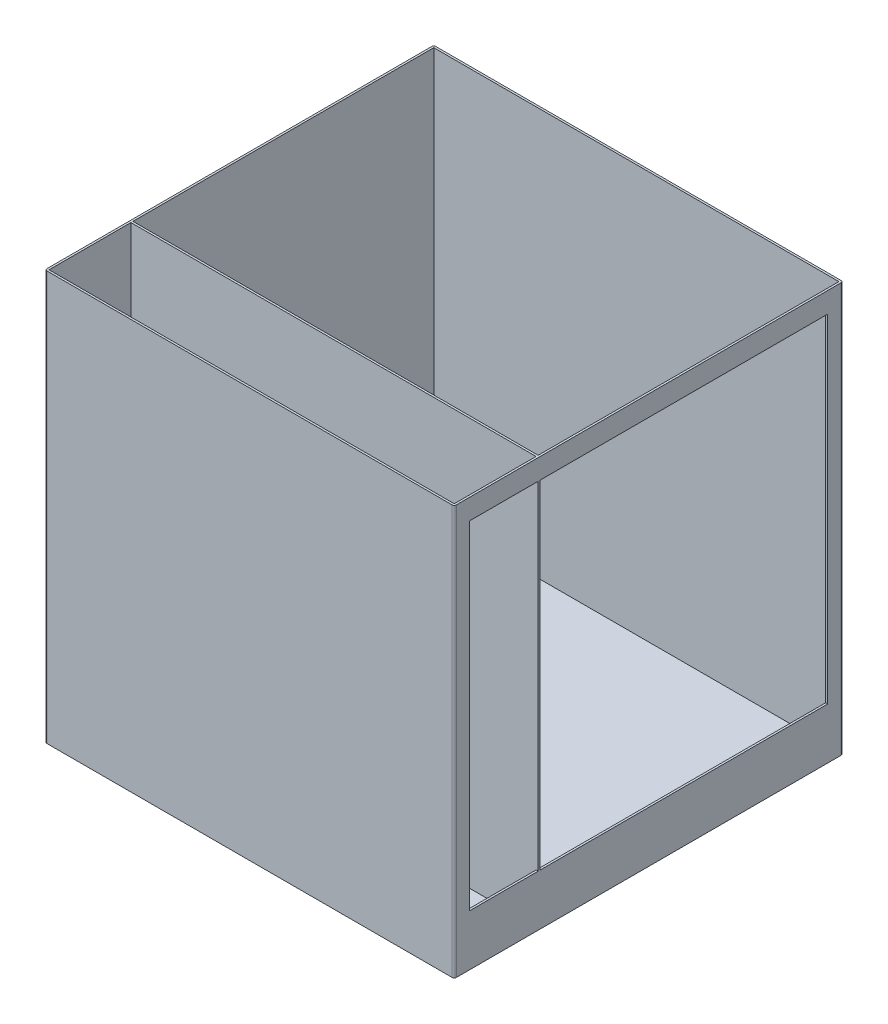
ISO-10303-21;
HEADER;
FILE_DESCRIPTION(('STEP AP214'),'2;1');
FILE_NAME('part.step','',(''),(''),'','','');
FILE_SCHEMA(('AUTOMOTIVE_DESIGN { 1 0 10303 214 1 1 1 1 }'));
ENDSEC;
DATA;
#1=APPLICATION_CONTEXT('core data for automotive mechanical design processes');
#2=APPLICATION_PROTOCOL_DEFINITION('international standard','automotive_design',2000,#1);
#3=PRODUCT_CONTEXT('',#1,'mechanical');
#4=PRODUCT('Part','Part','',(#3));
#5=PRODUCT_RELATED_PRODUCT_CATEGORY('part','',(#4));
#6=PRODUCT_DEFINITION_FORMATION('','',#4);
#7=PRODUCT_DEFINITION_CONTEXT('part definition',#1,'design');
#8=PRODUCT_DEFINITION('design','',#6,#7);
#9=PRODUCT_DEFINITION_SHAPE('','',#8);
#10=(LENGTH_UNIT() NAMED_UNIT(*) SI_UNIT(.MILLI.,.METRE.));
#11=(NAMED_UNIT(*) PLANE_ANGLE_UNIT() SI_UNIT($,.RADIAN.));
#12=(NAMED_UNIT(*) SI_UNIT($,.STERADIAN.) SOLID_ANGLE_UNIT());
#13=UNCERTAINTY_MEASURE_WITH_UNIT(LENGTH_MEASURE(1.E-05),#10,'distance_accuracy_value','');
#14=(GEOMETRIC_REPRESENTATION_CONTEXT(3) GLOBAL_UNCERTAINTY_ASSIGNED_CONTEXT((#13)) GLOBAL_UNIT_ASSIGNED_CONTEXT((#10,
#11,#12)) REPRESENTATION_CONTEXT('',''));
#15=CARTESIAN_POINT('',(0.,0.,0.));
#16=DIRECTION('',(0.,0.,1.));
#17=DIRECTION('',(1.,0.,0.));
#18=AXIS2_PLACEMENT_3D('',#15,#16,#17);
#19=CARTESIAN_POINT('',(198.,200.,190.));
#20=DIRECTION('',(-1.,0.,0.));
#21=DIRECTION('',(0.,0.,1.));
#22=AXIS2_PLACEMENT_3D('',#19,#20,#21);
#23=PLANE('',#22);
#24=DIRECTION('',(0.,-1.,0.));
#25=VECTOR('',#24,1.);
#26=CARTESIAN_POINT('',(198.,200.,106.));
#27=LINE('',#26,#25);
#28=CARTESIAN_POINT('',(198.,200.,106.));
#29=VERTEX_POINT('',#28);
#30=CARTESIAN_POINT('',(198.,180.,106.));
#31=VERTEX_POINT('',#30);
#32=EDGE_CURVE('E211',#29,#31,#27,.T.);
#33=ORIENTED_EDGE('',*,*,#32,.F.);
#34=DIRECTION('',(0.,0.,-1.));
#35=VECTOR('',#34,1.);
#36=CARTESIAN_POINT('',(198.,200.,0.));
#37=LINE('',#36,#35);
#38=CARTESIAN_POINT('',(198.,200.,-188.));
#39=VERTEX_POINT('',#38);
#40=EDGE_CURVE('E357',#29,#39,#37,.T.);
#41=ORIENTED_EDGE('',*,*,#40,.T.);
#42=DIRECTION('',(0.,1.,0.));
#43=VECTOR('',#42,1.);
#44=CARTESIAN_POINT('',(198.,200.,-188.));
#45=LINE('',#44,#43);
#46=CARTESIAN_POINT('',(198.,-198.,-188.));
#47=VERTEX_POINT('',#46);
#48=EDGE_CURVE('E344',#47,#39,#45,.T.);
#49=ORIENTED_EDGE('',*,*,#48,.F.);
#50=DIRECTION('',(0.,0.,-1.));
#51=VECTOR('',#50,1.);
#52=CARTESIAN_POINT('',(198.,-198.,0.));
#53=LINE('',#52,#51);
#54=CARTESIAN_POINT('',(198.,-198.,106.));
#55=VERTEX_POINT('',#54);
#56=EDGE_CURVE('E333',#55,#47,#53,.T.);
#57=ORIENTED_EDGE('',*,*,#56,.F.);
#58=CARTESIAN_POINT('',(198.,-150.,106.));
#59=VERTEX_POINT('',#58);
#60=EDGE_CURVE('E383',#59,#55,#27,.T.);
#61=ORIENTED_EDGE('',*,*,#60,.F.);
#62=DIRECTION('',(0.,0.,1.));
#63=VECTOR('',#62,1.);
#64=CARTESIAN_POINT('',(198.,-150.,-175.));
#65=LINE('',#64,#63);
#66=CARTESIAN_POINT('',(198.,-150.,-175.));
#67=VERTEX_POINT('',#66);
#68=EDGE_CURVE('E327',#67,#59,#65,.T.);
#69=ORIENTED_EDGE('',*,*,#68,.F.);
#70=DIRECTION('',(0.,-1.,0.));
#71=VECTOR('',#70,1.);
#72=CARTESIAN_POINT('',(198.,180.,-175.));
#73=LINE('',#72,#71);
#74=CARTESIAN_POINT('',(198.,180.,-175.));
#75=VERTEX_POINT('',#74);
#76=EDGE_CURVE('E323',#75,#67,#73,.T.);
#77=ORIENTED_EDGE('',*,*,#76,.F.);
#78=DIRECTION('',(0.,0.,-1.));
#79=VECTOR('',#78,1.);
#80=CARTESIAN_POINT('',(198.,180.,-175.));
#81=LINE('',#80,#79);
#82=EDGE_CURVE('E320',#31,#75,#81,.T.);
#83=ORIENTED_EDGE('',*,*,#82,.F.);
#84=EDGE_LOOP('',(#33,#41,#49,#57,#61,#69,#77,#83));
#85=FACE_BOUND('',#84,.T.);
#86=ADVANCED_FACE('F33',(#85),#23,.T.);
#87=CARTESIAN_POINT('',(-198.,200.,190.));
#88=DIRECTION('',(1.,0.,0.));
#89=DIRECTION('',(0.,0.,-1.));
#90=AXIS2_PLACEMENT_3D('',#87,#88,#89);
#91=PLANE('',#90);
#92=DIRECTION('',(0.,1.,0.));
#93=VECTOR('',#92,1.);
#94=CARTESIAN_POINT('',(-198.,200.,106.));
#95=LINE('',#94,#93);
#96=CARTESIAN_POINT('',(-198.,-198.,106.));
#97=VERTEX_POINT('',#96);
#98=CARTESIAN_POINT('',(-198.,200.,106.));
#99=VERTEX_POINT('',#98);
#100=EDGE_CURVE('E321',#97,#99,#95,.T.);
#101=ORIENTED_EDGE('',*,*,#100,.F.);
#102=DIRECTION('',(0.,0.,1.));
#103=VECTOR('',#102,1.);
#104=CARTESIAN_POINT('',(-198.,-198.,0.));
#105=LINE('',#104,#103);
#106=CARTESIAN_POINT('',(-198.,-198.,-188.));
#107=VERTEX_POINT('',#106);
#108=EDGE_CURVE('E352',#107,#97,#105,.T.);
#109=ORIENTED_EDGE('',*,*,#108,.F.);
#110=DIRECTION('',(0.,1.,0.));
#111=VECTOR('',#110,1.);
#112=CARTESIAN_POINT('',(-198.,200.,-188.));
#113=LINE('',#112,#111);
#114=CARTESIAN_POINT('',(-198.,200.,-188.));
#115=VERTEX_POINT('',#114);
#116=EDGE_CURVE('E347',#107,#115,#113,.T.);
#117=ORIENTED_EDGE('',*,*,#116,.T.);
#118=DIRECTION('',(0.,0.,1.));
#119=VECTOR('',#118,1.);
#120=CARTESIAN_POINT('',(-198.,200.,0.));
#121=LINE('',#120,#119);
#122=EDGE_CURVE('E218',#115,#99,#121,.T.);
#123=ORIENTED_EDGE('',*,*,#122,.T.);
#124=EDGE_LOOP('',(#101,#109,#117,#123));
#125=FACE_BOUND('',#124,.T.);
#126=ADVANCED_FACE('F375',(#125),#91,.T.);
#127=CARTESIAN_POINT('',(0.,-198.,0.));
#128=DIRECTION('',(0.,-1.,0.));
#129=DIRECTION('',(0.,0.,-1.));
#130=AXIS2_PLACEMENT_3D('',#127,#128,#129);
#131=PLANE('',#130);
#132=ORIENTED_EDGE('',*,*,#108,.T.);
#133=DIRECTION('',(1.,0.,0.));
#134=VECTOR('',#133,1.);
#135=CARTESIAN_POINT('',(0.,-198.,106.));
#136=LINE('',#135,#134);
#137=EDGE_CURVE('E380',#97,#55,#136,.T.);
#138=ORIENTED_EDGE('',*,*,#137,.T.);
#139=ORIENTED_EDGE('',*,*,#56,.T.);
#140=DIRECTION('',(-1.,0.,0.));
#141=VECTOR('',#140,1.);
#142=CARTESIAN_POINT('',(0.,-198.,-188.));
#143=LINE('',#142,#141);
#144=EDGE_CURVE('E343',#47,#107,#143,.T.);
#145=ORIENTED_EDGE('',*,*,#144,.T.);
#146=EDGE_LOOP('',(#132,#138,#139,#145));
#147=FACE_BOUND('',#146,.T.);
#148=ADVANCED_FACE('F379',(#147),#131,.F.);
#149=CARTESIAN_POINT('',(200.,-150.,-175.));
#150=DIRECTION('',(0.,-1.,0.));
#151=DIRECTION('',(0.,0.,-1.));
#152=AXIS2_PLACEMENT_3D('',#149,#150,#151);
#153=PLANE('',#152);
#154=ORIENTED_EDGE('',*,*,#68,.T.);
#155=DIRECTION('',(1.,0.,0.));
#156=VECTOR('',#155,1.);
#157=CARTESIAN_POINT('',(200.,-150.,106.));
#158=LINE('',#157,#156);
#159=CARTESIAN_POINT('',(200.,-150.,106.));
#160=VERTEX_POINT('',#159);
#161=EDGE_CURVE('E386',#59,#160,#158,.T.);
#162=ORIENTED_EDGE('',*,*,#161,.T.);
#163=DIRECTION('',(0.,0.,1.));
#164=VECTOR('',#163,1.);
#165=CARTESIAN_POINT('',(200.,-150.,-175.));
#166=LINE('',#165,#164);
#167=CARTESIAN_POINT('',(200.,-150.,-175.));
#168=VERTEX_POINT('',#167);
#169=EDGE_CURVE('E314',#168,#160,#166,.T.);
#170=ORIENTED_EDGE('',*,*,#169,.F.);
#171=DIRECTION('',(-1.,0.,0.));
#172=VECTOR('',#171,1.);
#173=CARTESIAN_POINT('',(200.,-150.,-175.));
#174=LINE('',#173,#172);
#175=EDGE_CURVE('E334',#168,#67,#174,.T.);
#176=ORIENTED_EDGE('',*,*,#175,.T.);
#177=EDGE_LOOP('',(#154,#162,#170,#176));
#178=FACE_BOUND('',#177,.T.);
#179=ADVANCED_FACE('F390',(#178),#153,.F.);
#180=CARTESIAN_POINT('',(200.,180.,-175.));
#181=DIRECTION('',(0.,1.,0.));
#182=DIRECTION('',(0.,0.,1.));
#183=AXIS2_PLACEMENT_3D('',#180,#181,#182);
#184=PLANE('',#183);
#185=DIRECTION('',(0.,0.,-1.));
#186=VECTOR('',#185,1.);
#187=CARTESIAN_POINT('',(200.,180.,-175.));
#188=LINE('',#187,#186);
#189=CARTESIAN_POINT('',(200.,180.,106.));
#190=VERTEX_POINT('',#189);
#191=CARTESIAN_POINT('',(200.,180.,-175.));
#192=VERTEX_POINT('',#191);
#193=EDGE_CURVE('E306',#190,#192,#188,.T.);
#194=ORIENTED_EDGE('',*,*,#193,.F.);
#195=DIRECTION('',(-1.,0.,0.));
#196=VECTOR('',#195,1.);
#197=CARTESIAN_POINT('',(200.,180.,106.));
#198=LINE('',#197,#196);
#199=EDGE_CURVE('E11',#190,#31,#198,.T.);
#200=ORIENTED_EDGE('',*,*,#199,.T.);
#201=ORIENTED_EDGE('',*,*,#82,.T.);
#202=DIRECTION('',(-1.,0.,0.));
#203=VECTOR('',#202,1.);
#204=CARTESIAN_POINT('',(200.,180.,-175.));
#205=LINE('',#204,#203);
#206=EDGE_CURVE('E336',#192,#75,#205,.T.);
#207=ORIENTED_EDGE('',*,*,#206,.F.);
#208=EDGE_LOOP('',(#194,#200,#201,#207));
#209=FACE_BOUND('',#208,.T.);
#210=ADVANCED_FACE('F398',(#209),#184,.F.);
#211=CARTESIAN_POINT('',(0.,200.,0.));
#212=DIRECTION('',(0.,-1.,0.));
#213=DIRECTION('',(0.,0.,-1.));
#214=AXIS2_PLACEMENT_3D('',#211,#212,#213);
#215=PLANE('',#214);
#216=DIRECTION('',(-1.,0.,0.));
#217=VECTOR('',#216,1.);
#218=CARTESIAN_POINT('',(-200.,200.,106.));
#219=LINE('',#218,#217);
#220=EDGE_CURVE('E202',#29,#99,#219,.T.);
#221=ORIENTED_EDGE('',*,*,#220,.T.);
#222=ORIENTED_EDGE('',*,*,#122,.F.);
#223=DIRECTION('',(-1.,0.,0.));
#224=VECTOR('',#223,1.);
#225=CARTESIAN_POINT('',(0.,200.,-188.));
#226=LINE('',#225,#224);
#227=EDGE_CURVE('E219',#39,#115,#226,.T.);
#228=ORIENTED_EDGE('',*,*,#227,.F.);
#229=ORIENTED_EDGE('',*,*,#40,.F.);
#230=EDGE_LOOP('',(#221,#222,#228,#229));
#231=FACE_BOUND('',#230,.T.);
#232=DIRECTION('',(1.,0.,0.));
#233=VECTOR('',#232,1.);
#234=CARTESIAN_POINT('',(-200.,200.,108.));
#235=LINE('',#234,#233);
#236=CARTESIAN_POINT('',(-198.,200.,108.));
#237=VERTEX_POINT('',#236);
#238=CARTESIAN_POINT('',(198.,200.,108.));
#239=VERTEX_POINT('',#238);
#240=EDGE_CURVE('E191',#237,#239,#235,.T.);
#241=ORIENTED_EDGE('',*,*,#240,.T.);
#242=CARTESIAN_POINT('',(198.,200.,188.));
#243=VERTEX_POINT('',#242);
#244=EDGE_CURVE('E223',#243,#239,#37,.T.);
#245=ORIENTED_EDGE('',*,*,#244,.F.);
#246=DIRECTION('',(1.,0.,0.));
#247=VECTOR('',#246,1.);
#248=CARTESIAN_POINT('',(0.,200.,188.));
#249=LINE('',#248,#247);
#250=CARTESIAN_POINT('',(-198.,200.,188.));
#251=VERTEX_POINT('',#250);
#252=EDGE_CURVE('E217',#251,#243,#249,.T.);
#253=ORIENTED_EDGE('',*,*,#252,.F.);
#254=EDGE_CURVE('E208',#237,#251,#121,.T.);
#255=ORIENTED_EDGE('',*,*,#254,.F.);
#256=EDGE_LOOP('',(#241,#245,#253,#255));
#257=FACE_BOUND('',#256,.T.);
#258=DIRECTION('',(0.,0.,-1.));
#259=VECTOR('',#258,1.);
#260=CARTESIAN_POINT('',(200.,200.,190.));
#261=LINE('',#260,#259);
#262=CARTESIAN_POINT('',(200.,200.,188.));
#263=VERTEX_POINT('',#262);
#264=CARTESIAN_POINT('',(200.,200.,-188.));
#265=VERTEX_POINT('',#264);
#266=EDGE_CURVE('E229',#263,#265,#261,.T.);
#267=ORIENTED_EDGE('',*,*,#266,.T.);
#268=CARTESIAN_POINT('',(198.,200.,-188.));
#269=DIRECTION('',(0.,-1.,0.));
#270=DIRECTION('',(0.,0.,-1.));
#271=AXIS2_PLACEMENT_3D('',#268,#269,#270);
#272=CIRCLE('',#271,2.);
#273=CARTESIAN_POINT('',(198.,200.,-190.));
#274=VERTEX_POINT('',#273);
#275=EDGE_CURVE('E275',#265,#274,#272,.F.);
#276=ORIENTED_EDGE('',*,*,#275,.T.);
#277=DIRECTION('',(-1.,0.,0.));
#278=VECTOR('',#277,1.);
#279=CARTESIAN_POINT('',(-200.,200.,-190.));
#280=LINE('',#279,#278);
#281=CARTESIAN_POINT('',(-198.,200.,-190.));
#282=VERTEX_POINT('',#281);
#283=EDGE_CURVE('E231',#274,#282,#280,.T.);
#284=ORIENTED_EDGE('',*,*,#283,.T.);
#285=CARTESIAN_POINT('',(-198.,200.,-188.));
#286=DIRECTION('',(0.,-1.,0.));
#287=DIRECTION('',(0.,0.,-1.));
#288=AXIS2_PLACEMENT_3D('',#285,#286,#287);
#289=CIRCLE('',#288,2.);
#290=CARTESIAN_POINT('',(-200.,200.,-188.));
#291=VERTEX_POINT('',#290);
#292=EDGE_CURVE('E277',#282,#291,#289,.F.);
#293=ORIENTED_EDGE('',*,*,#292,.T.);
#294=DIRECTION('',(0.,0.,1.));
#295=VECTOR('',#294,1.);
#296=CARTESIAN_POINT('',(-200.,200.,190.));
#297=LINE('',#296,#295);
#298=CARTESIAN_POINT('',(-200.,200.,188.));
#299=VERTEX_POINT('',#298);
#300=EDGE_CURVE('E235',#291,#299,#297,.T.);
#301=ORIENTED_EDGE('',*,*,#300,.T.);
#302=CARTESIAN_POINT('',(-198.,200.,188.));
#303=DIRECTION('',(0.,-1.,0.));
#304=DIRECTION('',(0.,0.,-1.));
#305=AXIS2_PLACEMENT_3D('',#302,#303,#304);
#306=CIRCLE('',#305,2.);
#307=CARTESIAN_POINT('',(-198.,200.,190.));
#308=VERTEX_POINT('',#307);
#309=EDGE_CURVE('E271',#299,#308,#306,.F.);
#310=ORIENTED_EDGE('',*,*,#309,.T.);
#311=DIRECTION('',(1.,0.,0.));
#312=VECTOR('',#311,1.);
#313=CARTESIAN_POINT('',(-200.,200.,190.));
#314=LINE('',#313,#312);
#315=CARTESIAN_POINT('',(198.,200.,190.));
#316=VERTEX_POINT('',#315);
#317=EDGE_CURVE('E237',#308,#316,#314,.T.);
#318=ORIENTED_EDGE('',*,*,#317,.T.);
#319=CARTESIAN_POINT('',(198.,200.,188.));
#320=DIRECTION('',(0.,-1.,0.));
#321=DIRECTION('',(0.,0.,-1.));
#322=AXIS2_PLACEMENT_3D('',#319,#320,#321);
#323=CIRCLE('',#322,2.);
#324=EDGE_CURVE('E273',#316,#263,#323,.F.);
#325=ORIENTED_EDGE('',*,*,#324,.T.);
#326=EDGE_LOOP('',(#267,#276,#284,#293,#301,#310,#318,#325));
#327=FACE_BOUND('',#326,.T.);
#328=ADVANCED_FACE('F215',(#231,#257,#327),#215,.F.);
#329=CARTESIAN_POINT('',(200.,200.,190.));
#330=DIRECTION('',(-1.,0.,0.));
#331=DIRECTION('',(0.,0.,1.));
#332=AXIS2_PLACEMENT_3D('',#329,#330,#331);
#333=PLANE('',#332);
#334=DIRECTION('',(0.,1.,0.));
#335=VECTOR('',#334,1.);
#336=CARTESIAN_POINT('',(200.,-200.,106.));
#337=LINE('',#336,#335);
#338=EDGE_CURVE('E401',#160,#190,#337,.T.);
#339=ORIENTED_EDGE('',*,*,#338,.T.);
#340=ORIENTED_EDGE('',*,*,#193,.T.);
#341=DIRECTION('',(0.,-1.,0.));
#342=VECTOR('',#341,1.);
#343=CARTESIAN_POINT('',(200.,180.,-175.));
#344=LINE('',#343,#342);
#345=EDGE_CURVE('E305',#192,#168,#344,.T.);
#346=ORIENTED_EDGE('',*,*,#345,.T.);
#347=ORIENTED_EDGE('',*,*,#169,.T.);
#348=EDGE_LOOP('',(#339,#340,#346,#347));
#349=FACE_BOUND('',#348,.T.);
#350=DIRECTION('',(0.,1.,0.));
#351=VECTOR('',#350,1.);
#352=CARTESIAN_POINT('',(200.,-200.,108.));
#353=LINE('',#352,#351);
#354=CARTESIAN_POINT('',(200.,-150.,108.));
#355=VERTEX_POINT('',#354);
#356=CARTESIAN_POINT('',(200.,180.,108.));
#357=VERTEX_POINT('',#356);
#358=EDGE_CURVE('E54',#355,#357,#353,.T.);
#359=ORIENTED_EDGE('',*,*,#358,.F.);
#360=CARTESIAN_POINT('',(200.,-150.,175.));
#361=VERTEX_POINT('',#360);
#362=EDGE_CURVE('E309',#355,#361,#166,.T.);
#363=ORIENTED_EDGE('',*,*,#362,.T.);
#364=DIRECTION('',(0.,1.,0.));
#365=VECTOR('',#364,1.);
#366=CARTESIAN_POINT('',(200.,180.,175.));
#367=LINE('',#366,#365);
#368=CARTESIAN_POINT('',(200.,180.,175.));
#369=VERTEX_POINT('',#368);
#370=EDGE_CURVE('E304',#361,#369,#367,.T.);
#371=ORIENTED_EDGE('',*,*,#370,.T.);
#372=EDGE_CURVE('E295',#369,#357,#188,.T.);
#373=ORIENTED_EDGE('',*,*,#372,.T.);
#374=EDGE_LOOP('',(#359,#363,#371,#373));
#375=FACE_BOUND('',#374,.T.);
#376=DIRECTION('',(0.,0.,-1.));
#377=VECTOR('',#376,1.);
#378=CARTESIAN_POINT('',(200.,-200.,190.));
#379=LINE('',#378,#377);
#380=CARTESIAN_POINT('',(200.,-200.,188.));
#381=VERTEX_POINT('',#380);
#382=CARTESIAN_POINT('',(200.,-200.,-188.));
#383=VERTEX_POINT('',#382);
#384=EDGE_CURVE('E241',#381,#383,#379,.T.);
#385=ORIENTED_EDGE('',*,*,#384,.T.);
#386=DIRECTION('',(0.,-1.,0.));
#387=VECTOR('',#386,1.);
#388=CARTESIAN_POINT('',(200.,200.,-188.));
#389=LINE('',#388,#387);
#390=EDGE_CURVE('E282',#383,#265,#389,.F.);
#391=ORIENTED_EDGE('',*,*,#390,.T.);
#392=ORIENTED_EDGE('',*,*,#266,.F.);
#393=DIRECTION('',(0.,-1.,0.));
#394=VECTOR('',#393,1.);
#395=CARTESIAN_POINT('',(200.,200.,188.));
#396=LINE('',#395,#394);
#397=EDGE_CURVE('E279',#263,#381,#396,.T.);
#398=ORIENTED_EDGE('',*,*,#397,.T.);
#399=EDGE_LOOP('',(#385,#391,#392,#398));
#400=FACE_BOUND('',#399,.T.);
#401=ADVANCED_FACE('F300',(#349,#375,#400),#333,.F.);
#402=CARTESIAN_POINT('',(-200.,200.,-190.));
#403=DIRECTION('',(0.,0.,1.));
#404=DIRECTION('',(1.,0.,0.));
#405=AXIS2_PLACEMENT_3D('',#402,#403,#404);
#406=PLANE('',#405);
#407=DIRECTION('',(-1.,0.,0.));
#408=VECTOR('',#407,1.);
#409=CARTESIAN_POINT('',(-200.,-200.,-190.));
#410=LINE('',#409,#408);
#411=CARTESIAN_POINT('',(198.,-200.,-190.));
#412=VERTEX_POINT('',#411);
#413=CARTESIAN_POINT('',(-198.,-200.,-190.));
#414=VERTEX_POINT('',#413);
#415=EDGE_CURVE('E243',#412,#414,#410,.T.);
#416=ORIENTED_EDGE('',*,*,#415,.T.);
#417=DIRECTION('',(0.,-1.,0.));
#418=VECTOR('',#417,1.);
#419=CARTESIAN_POINT('',(-198.,200.,-190.));
#420=LINE('',#419,#418);
#421=EDGE_CURVE('E269',#414,#282,#420,.F.);
#422=ORIENTED_EDGE('',*,*,#421,.T.);
#423=ORIENTED_EDGE('',*,*,#283,.F.);
#424=DIRECTION('',(0.,-1.,0.));
#425=VECTOR('',#424,1.);
#426=CARTESIAN_POINT('',(198.,200.,-190.));
#427=LINE('',#426,#425);
#428=EDGE_CURVE('E266',#274,#412,#427,.T.);
#429=ORIENTED_EDGE('',*,*,#428,.T.);
#430=EDGE_LOOP('',(#416,#422,#423,#429));
#431=FACE_BOUND('',#430,.T.);
#432=ADVANCED_FACE('F477',(#431),#406,.F.);
#433=CARTESIAN_POINT('',(-200.,200.,190.));
#434=DIRECTION('',(1.,0.,0.));
#435=DIRECTION('',(0.,0.,-1.));
#436=AXIS2_PLACEMENT_3D('',#433,#434,#435);
#437=PLANE('',#436);
#438=DIRECTION('',(0.,-1.,0.));
#439=VECTOR('',#438,1.);
#440=CARTESIAN_POINT('',(-200.,200.,188.));
#441=LINE('',#440,#439);
#442=CARTESIAN_POINT('',(-200.,-200.,188.));
#443=VERTEX_POINT('',#442);
#444=EDGE_CURVE('E240',#443,#299,#441,.F.);
#445=ORIENTED_EDGE('',*,*,#444,.T.);
#446=ORIENTED_EDGE('',*,*,#300,.F.);
#447=DIRECTION('',(0.,-1.,0.));
#448=VECTOR('',#447,1.);
#449=CARTESIAN_POINT('',(-200.,200.,-188.));
#450=LINE('',#449,#448);
#451=CARTESIAN_POINT('',(-200.,-200.,-188.));
#452=VERTEX_POINT('',#451);
#453=EDGE_CURVE('E253',#291,#452,#450,.T.);
#454=ORIENTED_EDGE('',*,*,#453,.T.);
#455=DIRECTION('',(0.,0.,1.));
#456=VECTOR('',#455,1.);
#457=CARTESIAN_POINT('',(-200.,-200.,190.));
#458=LINE('',#457,#456);
#459=EDGE_CURVE('E247',#452,#443,#458,.T.);
#460=ORIENTED_EDGE('',*,*,#459,.T.);
#461=EDGE_LOOP('',(#445,#446,#454,#460));
#462=FACE_BOUND('',#461,.T.);
#463=ADVANCED_FACE('F484',(#462),#437,.F.);
#464=CARTESIAN_POINT('',(-200.,200.,190.));
#465=DIRECTION('',(0.,0.,-1.));
#466=DIRECTION('',(-1.,0.,0.));
#467=AXIS2_PLACEMENT_3D('',#464,#465,#466);
#468=PLANE('',#467);
#469=DIRECTION('',(1.,0.,0.));
#470=VECTOR('',#469,1.);
#471=CARTESIAN_POINT('',(-200.,-200.,190.));
#472=LINE('',#471,#470);
#473=CARTESIAN_POINT('',(-198.,-200.,190.));
#474=VERTEX_POINT('',#473);
#475=CARTESIAN_POINT('',(198.,-200.,190.));
#476=VERTEX_POINT('',#475);
#477=EDGE_CURVE('E232',#474,#476,#472,.T.);
#478=ORIENTED_EDGE('',*,*,#477,.T.);
#479=DIRECTION('',(0.,-1.,0.));
#480=VECTOR('',#479,1.);
#481=CARTESIAN_POINT('',(198.,200.,190.));
#482=LINE('',#481,#480);
#483=EDGE_CURVE('E288',#476,#316,#482,.F.);
#484=ORIENTED_EDGE('',*,*,#483,.T.);
#485=ORIENTED_EDGE('',*,*,#317,.F.);
#486=DIRECTION('',(0.,-1.,0.));
#487=VECTOR('',#486,1.);
#488=CARTESIAN_POINT('',(-198.,200.,190.));
#489=LINE('',#488,#487);
#490=EDGE_CURVE('E285',#308,#474,#489,.T.);
#491=ORIENTED_EDGE('',*,*,#490,.T.);
#492=EDGE_LOOP('',(#478,#484,#485,#491));
#493=FACE_BOUND('',#492,.T.);
#494=ADVANCED_FACE('F464',(#493),#468,.F.);
#495=CARTESIAN_POINT('',(0.,-200.,0.));
#496=DIRECTION('',(0.,-1.,0.));
#497=DIRECTION('',(0.,0.,-1.));
#498=AXIS2_PLACEMENT_3D('',#495,#496,#497);
#499=PLANE('',#498);
#500=CARTESIAN_POINT('',(-198.,-200.,188.));
#501=DIRECTION('',(0.,-1.,0.));
#502=DIRECTION('',(0.,0.,-1.));
#503=AXIS2_PLACEMENT_3D('',#500,#501,#502);
#504=CIRCLE('',#503,2.);
#505=EDGE_CURVE('E256',#474,#443,#504,.T.);
#506=ORIENTED_EDGE('',*,*,#505,.T.);
#507=ORIENTED_EDGE('',*,*,#459,.F.);
#508=CARTESIAN_POINT('',(-198.,-200.,-188.));
#509=DIRECTION('',(0.,-1.,0.));
#510=DIRECTION('',(0.,0.,-1.));
#511=AXIS2_PLACEMENT_3D('',#508,#509,#510);
#512=CIRCLE('',#511,2.);
#513=EDGE_CURVE('E264',#452,#414,#512,.T.);
#514=ORIENTED_EDGE('',*,*,#513,.T.);
#515=ORIENTED_EDGE('',*,*,#415,.F.);
#516=CARTESIAN_POINT('',(198.,-200.,-188.));
#517=DIRECTION('',(0.,-1.,0.));
#518=DIRECTION('',(0.,0.,-1.));
#519=AXIS2_PLACEMENT_3D('',#516,#517,#518);
#520=CIRCLE('',#519,2.);
#521=EDGE_CURVE('E261',#412,#383,#520,.T.);
#522=ORIENTED_EDGE('',*,*,#521,.T.);
#523=ORIENTED_EDGE('',*,*,#384,.F.);
#524=CARTESIAN_POINT('',(198.,-200.,188.));
#525=DIRECTION('',(0.,-1.,0.));
#526=DIRECTION('',(0.,0.,-1.));
#527=AXIS2_PLACEMENT_3D('',#524,#525,#526);
#528=CIRCLE('',#527,2.);
#529=EDGE_CURVE('E259',#381,#476,#528,.T.);
#530=ORIENTED_EDGE('',*,*,#529,.T.);
#531=ORIENTED_EDGE('',*,*,#477,.F.);
#532=EDGE_LOOP('',(#506,#507,#514,#515,#522,#523,#530,#531));
#533=FACE_BOUND('',#532,.T.);
#534=ADVANCED_FACE('F487',(#533),#499,.T.);
#535=CARTESIAN_POINT('',(-198.,200.,-188.));
#536=DIRECTION('',(0.,-1.,0.));
#537=DIRECTION('',(0.,0.,-1.));
#538=AXIS2_PLACEMENT_3D('',#535,#536,#537);
#539=CYLINDRICAL_SURFACE('',#538,2.);
#540=ORIENTED_EDGE('',*,*,#292,.F.);
#541=ORIENTED_EDGE('',*,*,#421,.F.);
#542=ORIENTED_EDGE('',*,*,#513,.F.);
#543=ORIENTED_EDGE('',*,*,#453,.F.);
#544=EDGE_LOOP('',(#540,#541,#542,#543));
#545=FACE_BOUND('',#544,.T.);
#546=ADVANCED_FACE('F481',(#545),#539,.T.);
#547=CARTESIAN_POINT('',(198.,200.,-188.));
#548=DIRECTION('',(0.,-1.,0.));
#549=DIRECTION('',(0.,0.,-1.));
#550=AXIS2_PLACEMENT_3D('',#547,#548,#549);
#551=CYLINDRICAL_SURFACE('',#550,2.);
#552=ORIENTED_EDGE('',*,*,#275,.F.);
#553=ORIENTED_EDGE('',*,*,#390,.F.);
#554=ORIENTED_EDGE('',*,*,#521,.F.);
#555=ORIENTED_EDGE('',*,*,#428,.F.);
#556=EDGE_LOOP('',(#552,#553,#554,#555));
#557=FACE_BOUND('',#556,.T.);
#558=ADVANCED_FACE('F455',(#557),#551,.T.);
#559=CARTESIAN_POINT('',(198.,200.,188.));
#560=DIRECTION('',(0.,-1.,0.));
#561=DIRECTION('',(0.,0.,-1.));
#562=AXIS2_PLACEMENT_3D('',#559,#560,#561);
#563=CYLINDRICAL_SURFACE('',#562,2.);
#564=ORIENTED_EDGE('',*,*,#324,.F.);
#565=ORIENTED_EDGE('',*,*,#483,.F.);
#566=ORIENTED_EDGE('',*,*,#529,.F.);
#567=ORIENTED_EDGE('',*,*,#397,.F.);
#568=EDGE_LOOP('',(#564,#565,#566,#567));
#569=FACE_BOUND('',#568,.T.);
#570=ADVANCED_FACE('F450',(#569),#563,.T.);
#571=CARTESIAN_POINT('',(-198.,200.,188.));
#572=DIRECTION('',(0.,-1.,0.));
#573=DIRECTION('',(0.,0.,-1.));
#574=AXIS2_PLACEMENT_3D('',#571,#572,#573);
#575=CYLINDRICAL_SURFACE('',#574,2.);
#576=ORIENTED_EDGE('',*,*,#309,.F.);
#577=ORIENTED_EDGE('',*,*,#444,.F.);
#578=ORIENTED_EDGE('',*,*,#505,.F.);
#579=ORIENTED_EDGE('',*,*,#490,.F.);
#580=EDGE_LOOP('',(#576,#577,#578,#579));
#581=FACE_BOUND('',#580,.T.);
#582=ADVANCED_FACE('F35',(#581),#575,.T.);
#583=DIRECTION('',(0.,1.,0.));
#584=VECTOR('',#583,1.);
#585=CARTESIAN_POINT('',(198.,200.,108.));
#586=LINE('',#585,#584);
#587=CARTESIAN_POINT('',(198.,-198.,108.));
#588=VERTEX_POINT('',#587);
#589=CARTESIAN_POINT('',(198.,-150.,108.));
#590=VERTEX_POINT('',#589);
#591=EDGE_CURVE('E48',#588,#590,#586,.T.);
#592=ORIENTED_EDGE('',*,*,#591,.F.);
#593=CARTESIAN_POINT('',(198.,-198.,188.));
#594=VERTEX_POINT('',#593);
#595=EDGE_CURVE('E340',#594,#588,#53,.T.);
#596=ORIENTED_EDGE('',*,*,#595,.F.);
#597=DIRECTION('',(0.,1.,0.));
#598=VECTOR('',#597,1.);
#599=CARTESIAN_POINT('',(198.,200.,188.));
#600=LINE('',#599,#598);
#601=EDGE_CURVE('E244',#594,#243,#600,.T.);
#602=ORIENTED_EDGE('',*,*,#601,.T.);
#603=ORIENTED_EDGE('',*,*,#244,.T.);
#604=CARTESIAN_POINT('',(198.,180.,108.));
#605=VERTEX_POINT('',#604);
#606=EDGE_CURVE('E197',#605,#239,#586,.T.);
#607=ORIENTED_EDGE('',*,*,#606,.F.);
#608=CARTESIAN_POINT('',(198.,180.,175.));
#609=VERTEX_POINT('',#608);
#610=EDGE_CURVE('E298',#609,#605,#81,.T.);
#611=ORIENTED_EDGE('',*,*,#610,.F.);
#612=DIRECTION('',(0.,1.,0.));
#613=VECTOR('',#612,1.);
#614=CARTESIAN_POINT('',(198.,180.,175.));
#615=LINE('',#614,#613);
#616=CARTESIAN_POINT('',(198.,-150.,175.));
#617=VERTEX_POINT('',#616);
#618=EDGE_CURVE('E318',#617,#609,#615,.T.);
#619=ORIENTED_EDGE('',*,*,#618,.F.);
#620=EDGE_CURVE('E326',#590,#617,#65,.T.);
#621=ORIENTED_EDGE('',*,*,#620,.F.);
#622=EDGE_LOOP('',(#592,#596,#602,#603,#607,#611,#619,#621));
#623=FACE_BOUND('',#622,.T.);
#624=ADVANCED_FACE('F416',(#623),#23,.T.);
#625=CARTESIAN_POINT('',(-200.,200.,-188.));
#626=DIRECTION('',(0.,0.,1.));
#627=DIRECTION('',(1.,0.,0.));
#628=AXIS2_PLACEMENT_3D('',#625,#626,#627);
#629=PLANE('',#628);
#630=ORIENTED_EDGE('',*,*,#144,.F.);
#631=ORIENTED_EDGE('',*,*,#48,.T.);
#632=ORIENTED_EDGE('',*,*,#227,.T.);
#633=ORIENTED_EDGE('',*,*,#116,.F.);
#634=EDGE_LOOP('',(#630,#631,#632,#633));
#635=FACE_BOUND('',#634,.T.);
#636=ADVANCED_FACE('F370',(#635),#629,.T.);
#637=DIRECTION('',(0.,-1.,0.));
#638=VECTOR('',#637,1.);
#639=CARTESIAN_POINT('',(-198.,200.,108.));
#640=LINE('',#639,#638);
#641=CARTESIAN_POINT('',(-198.,-198.,108.));
#642=VERTEX_POINT('',#641);
#643=EDGE_CURVE('E194',#237,#642,#640,.T.);
#644=ORIENTED_EDGE('',*,*,#643,.F.);
#645=ORIENTED_EDGE('',*,*,#254,.T.);
#646=DIRECTION('',(0.,1.,0.));
#647=VECTOR('',#646,1.);
#648=CARTESIAN_POINT('',(-198.,200.,188.));
#649=LINE('',#648,#647);
#650=CARTESIAN_POINT('',(-198.,-198.,188.));
#651=VERTEX_POINT('',#650);
#652=EDGE_CURVE('E228',#651,#251,#649,.T.);
#653=ORIENTED_EDGE('',*,*,#652,.F.);
#654=EDGE_CURVE('E210',#642,#651,#105,.T.);
#655=ORIENTED_EDGE('',*,*,#654,.F.);
#656=EDGE_LOOP('',(#644,#645,#653,#655));
#657=FACE_BOUND('',#656,.T.);
#658=ADVANCED_FACE('F206',(#657),#91,.T.);
#659=CARTESIAN_POINT('',(-200.,200.,188.));
#660=DIRECTION('',(0.,0.,-1.));
#661=DIRECTION('',(-1.,0.,0.));
#662=AXIS2_PLACEMENT_3D('',#659,#660,#661);
#663=PLANE('',#662);
#664=DIRECTION('',(1.,0.,0.));
#665=VECTOR('',#664,1.);
#666=CARTESIAN_POINT('',(0.,-198.,188.));
#667=LINE('',#666,#665);
#668=EDGE_CURVE('E355',#651,#594,#667,.T.);
#669=ORIENTED_EDGE('',*,*,#668,.F.);
#670=ORIENTED_EDGE('',*,*,#652,.T.);
#671=ORIENTED_EDGE('',*,*,#252,.T.);
#672=ORIENTED_EDGE('',*,*,#601,.F.);
#673=EDGE_LOOP('',(#669,#670,#671,#672));
#674=FACE_BOUND('',#673,.T.);
#675=ADVANCED_FACE('F432',(#674),#663,.T.);
#676=ORIENTED_EDGE('',*,*,#595,.T.);
#677=DIRECTION('',(-1.,0.,0.));
#678=VECTOR('',#677,1.);
#679=CARTESIAN_POINT('',(0.,-198.,108.));
#680=LINE('',#679,#678);
#681=EDGE_CURVE('E212',#588,#642,#680,.T.);
#682=ORIENTED_EDGE('',*,*,#681,.T.);
#683=ORIENTED_EDGE('',*,*,#654,.T.);
#684=ORIENTED_EDGE('',*,*,#668,.T.);
#685=EDGE_LOOP('',(#676,#682,#683,#684));
#686=FACE_BOUND('',#685,.T.);
#687=ADVANCED_FACE('F413',(#686),#131,.F.);
#688=CARTESIAN_POINT('',(200.,180.,175.));
#689=DIRECTION('',(0.,0.,1.));
#690=DIRECTION('',(0.,-1.,0.));
#691=AXIS2_PLACEMENT_3D('',#688,#689,#690);
#692=PLANE('',#691);
#693=ORIENTED_EDGE('',*,*,#618,.T.);
#694=DIRECTION('',(-1.,0.,0.));
#695=VECTOR('',#694,1.);
#696=CARTESIAN_POINT('',(200.,180.,175.));
#697=LINE('',#696,#695);
#698=EDGE_CURVE('E317',#369,#609,#697,.T.);
#699=ORIENTED_EDGE('',*,*,#698,.F.);
#700=ORIENTED_EDGE('',*,*,#370,.F.);
#701=DIRECTION('',(-1.,0.,0.));
#702=VECTOR('',#701,1.);
#703=CARTESIAN_POINT('',(200.,-150.,175.));
#704=LINE('',#703,#702);
#705=EDGE_CURVE('E330',#361,#617,#704,.T.);
#706=ORIENTED_EDGE('',*,*,#705,.T.);
#707=EDGE_LOOP('',(#693,#699,#700,#706));
#708=FACE_BOUND('',#707,.T.);
#709=ADVANCED_FACE('F422',(#708),#692,.F.);
#710=ORIENTED_EDGE('',*,*,#362,.F.);
#711=DIRECTION('',(-1.,0.,0.));
#712=VECTOR('',#711,1.);
#713=CARTESIAN_POINT('',(200.,-150.,108.));
#714=LINE('',#713,#712);
#715=EDGE_CURVE('E404',#355,#590,#714,.T.);
#716=ORIENTED_EDGE('',*,*,#715,.T.);
#717=ORIENTED_EDGE('',*,*,#620,.T.);
#718=ORIENTED_EDGE('',*,*,#705,.F.);
#719=EDGE_LOOP('',(#710,#716,#717,#718));
#720=FACE_BOUND('',#719,.T.);
#721=ADVANCED_FACE('F420',(#720),#153,.F.);
#722=CARTESIAN_POINT('',(200.,180.,-175.));
#723=DIRECTION('',(0.,0.,-1.));
#724=DIRECTION('',(0.,1.,0.));
#725=AXIS2_PLACEMENT_3D('',#722,#723,#724);
#726=PLANE('',#725);
#727=ORIENTED_EDGE('',*,*,#76,.T.);
#728=ORIENTED_EDGE('',*,*,#175,.F.);
#729=ORIENTED_EDGE('',*,*,#345,.F.);
#730=ORIENTED_EDGE('',*,*,#206,.T.);
#731=EDGE_LOOP('',(#727,#728,#729,#730));
#732=FACE_BOUND('',#731,.T.);
#733=ADVANCED_FACE('F394',(#732),#726,.F.);
#734=ORIENTED_EDGE('',*,*,#610,.T.);
#735=DIRECTION('',(1.,0.,0.));
#736=VECTOR('',#735,1.);
#737=CARTESIAN_POINT('',(200.,180.,108.));
#738=LINE('',#737,#736);
#739=EDGE_CURVE('E41',#605,#357,#738,.T.);
#740=ORIENTED_EDGE('',*,*,#739,.T.);
#741=ORIENTED_EDGE('',*,*,#372,.F.);
#742=ORIENTED_EDGE('',*,*,#698,.T.);
#743=EDGE_LOOP('',(#734,#740,#741,#742));
#744=FACE_BOUND('',#743,.T.);
#745=ADVANCED_FACE('F293',(#744),#184,.F.);
#746=CARTESIAN_POINT('',(-200.,-200.,106.));
#747=DIRECTION('',(0.,0.,-1.));
#748=DIRECTION('',(-1.,0.,0.));
#749=AXIS2_PLACEMENT_3D('',#746,#747,#748);
#750=PLANE('',#749);
#751=ORIENTED_EDGE('',*,*,#137,.F.);
#752=ORIENTED_EDGE('',*,*,#100,.T.);
#753=ORIENTED_EDGE('',*,*,#220,.F.);
#754=ORIENTED_EDGE('',*,*,#32,.T.);
#755=ORIENTED_EDGE('',*,*,#199,.F.);
#756=ORIENTED_EDGE('',*,*,#338,.F.);
#757=ORIENTED_EDGE('',*,*,#161,.F.);
#758=ORIENTED_EDGE('',*,*,#60,.T.);
#759=EDGE_LOOP('',(#751,#752,#753,#754,#755,#756,#757,#758));
#760=FACE_BOUND('',#759,.T.);
#761=ADVANCED_FACE('F400',(#760),#750,.T.);
#762=CARTESIAN_POINT('',(-200.,-200.,108.));
#763=DIRECTION('',(0.,0.,1.));
#764=DIRECTION('',(1.,0.,0.));
#765=AXIS2_PLACEMENT_3D('',#762,#763,#764);
#766=PLANE('',#765);
#767=ORIENTED_EDGE('',*,*,#240,.F.);
#768=ORIENTED_EDGE('',*,*,#643,.T.);
#769=ORIENTED_EDGE('',*,*,#681,.F.);
#770=ORIENTED_EDGE('',*,*,#591,.T.);
#771=ORIENTED_EDGE('',*,*,#715,.F.);
#772=ORIENTED_EDGE('',*,*,#358,.T.);
#773=ORIENTED_EDGE('',*,*,#739,.F.);
#774=ORIENTED_EDGE('',*,*,#606,.T.);
#775=EDGE_LOOP('',(#767,#768,#769,#770,#771,#772,#773,#774));
#776=FACE_BOUND('',#775,.T.);
#777=ADVANCED_FACE('F193',(#776),#766,.T.);
#778=CLOSED_SHELL('',(#86,#126,#148,#179,#210,#328,#401,#432,#463,#494,#534,#546,#558,#570,#582,
#624,#636,#658,#675,#687,#709,#721,#733,#745,#761,#777));
#779=MANIFOLD_SOLID_BREP('B2',#778);
#780=ADVANCED_BREP_SHAPE_REPRESENTATION('',(#18,#779),#14);
#781=SHAPE_DEFINITION_REPRESENTATION(#9,#780);
ENDSEC;
END-ISO-10303-21;
